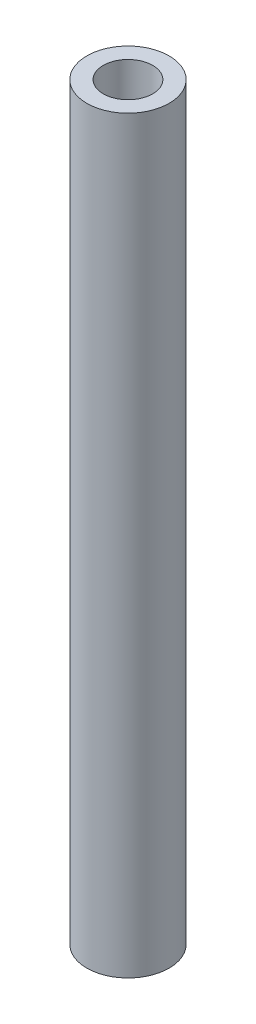
ISO-10303-21;
HEADER;
FILE_DESCRIPTION(('STEP AP214'),'2;1');
FILE_NAME('part.step','',(''),(''),'','','');
FILE_SCHEMA(('AUTOMOTIVE_DESIGN { 1 0 10303 214 1 1 1 1 }'));
ENDSEC;
DATA;
#1=APPLICATION_CONTEXT('core data for automotive mechanical design processes');
#2=APPLICATION_PROTOCOL_DEFINITION('international standard','automotive_design',2000,#1);
#3=PRODUCT_CONTEXT('',#1,'mechanical');
#4=PRODUCT('Part','Part','',(#3));
#5=PRODUCT_RELATED_PRODUCT_CATEGORY('part','',(#4));
#6=PRODUCT_DEFINITION_FORMATION('','',#4);
#7=PRODUCT_DEFINITION_CONTEXT('part definition',#1,'design');
#8=PRODUCT_DEFINITION('design','',#6,#7);
#9=PRODUCT_DEFINITION_SHAPE('','',#8);
#10=(LENGTH_UNIT() NAMED_UNIT(*) SI_UNIT(.MILLI.,.METRE.));
#11=(NAMED_UNIT(*) PLANE_ANGLE_UNIT() SI_UNIT($,.RADIAN.));
#12=(NAMED_UNIT(*) SI_UNIT($,.STERADIAN.) SOLID_ANGLE_UNIT());
#13=UNCERTAINTY_MEASURE_WITH_UNIT(LENGTH_MEASURE(1.E-05),#10,'distance_accuracy_value','');
#14=(GEOMETRIC_REPRESENTATION_CONTEXT(3) GLOBAL_UNCERTAINTY_ASSIGNED_CONTEXT((#13)) GLOBAL_UNIT_ASSIGNED_CONTEXT((#10,
#11,#12)) REPRESENTATION_CONTEXT('',''));
#15=CARTESIAN_POINT('',(0.,0.,0.));
#16=DIRECTION('',(0.,0.,1.));
#17=DIRECTION('',(1.,0.,0.));
#18=AXIS2_PLACEMENT_3D('',#15,#16,#17);
#19=CARTESIAN_POINT('',(0.,45.5,0.));
#20=DIRECTION('',(0.,1.,0.));
#21=DIRECTION('',(0.,0.,1.));
#22=AXIS2_PLACEMENT_3D('',#19,#20,#21);
#23=PLANE('',#22);
#24=CARTESIAN_POINT('',(0.,45.5,0.));
#25=DIRECTION('',(0.,1.,0.));
#26=DIRECTION('',(0.,0.,1.));
#27=AXIS2_PLACEMENT_3D('',#24,#25,#26);
#28=CIRCLE('',#27,2.5);
#29=CARTESIAN_POINT('',(0.,45.5,2.5));
#30=VERTEX_POINT('',#29);
#31=EDGE_CURVE('E10',#30,#30,#28,.T.);
#32=ORIENTED_EDGE('',*,*,#31,.T.);
#33=EDGE_LOOP('',(#32));
#34=FACE_BOUND('',#33,.T.);
#35=CARTESIAN_POINT('',(0.,45.5,0.));
#36=DIRECTION('',(0.,1.,0.));
#37=DIRECTION('',(0.,0.,1.));
#38=AXIS2_PLACEMENT_3D('',#35,#36,#37);
#39=CIRCLE('',#38,1.5);
#40=CARTESIAN_POINT('',(0.,45.5,1.5));
#41=VERTEX_POINT('',#40);
#42=EDGE_CURVE('E44',#41,#41,#39,.T.);
#43=ORIENTED_EDGE('',*,*,#42,.F.);
#44=EDGE_LOOP('',(#43));
#45=FACE_BOUND('',#44,.T.);
#46=ADVANCED_FACE('F33',(#34,#45),#23,.T.);
#47=CARTESIAN_POINT('',(0.,0.,0.));
#48=DIRECTION('',(0.,1.,0.));
#49=DIRECTION('',(0.,0.,1.));
#50=AXIS2_PLACEMENT_3D('',#47,#48,#49);
#51=PLANE('',#50);
#52=CARTESIAN_POINT('',(0.,0.,0.));
#53=DIRECTION('',(0.,1.,0.));
#54=DIRECTION('',(0.,0.,1.));
#55=AXIS2_PLACEMENT_3D('',#52,#53,#54);
#56=CIRCLE('',#55,2.5);
#57=CARTESIAN_POINT('',(0.,0.,2.5));
#58=VERTEX_POINT('',#57);
#59=EDGE_CURVE('E37',#58,#58,#56,.T.);
#60=ORIENTED_EDGE('',*,*,#59,.F.);
#61=EDGE_LOOP('',(#60));
#62=FACE_BOUND('',#61,.T.);
#63=CARTESIAN_POINT('',(0.,0.,0.));
#64=DIRECTION('',(0.,1.,0.));
#65=DIRECTION('',(0.,0.,1.));
#66=AXIS2_PLACEMENT_3D('',#63,#64,#65);
#67=CIRCLE('',#66,1.5);
#68=CARTESIAN_POINT('',(0.,0.,1.5));
#69=VERTEX_POINT('',#68);
#70=EDGE_CURVE('E46',#69,#69,#67,.T.);
#71=ORIENTED_EDGE('',*,*,#70,.T.);
#72=EDGE_LOOP('',(#71));
#73=FACE_BOUND('',#72,.T.);
#74=ADVANCED_FACE('F56',(#62,#73),#51,.F.);
#75=CARTESIAN_POINT('',(0.,45.5,0.));
#76=DIRECTION('',(0.,-1.,0.));
#77=DIRECTION('',(0.,0.,-1.));
#78=AXIS2_PLACEMENT_3D('',#75,#76,#77);
#79=CYLINDRICAL_SURFACE('',#78,2.5);
#80=ORIENTED_EDGE('',*,*,#31,.F.);
#81=EDGE_LOOP('',(#80));
#82=FACE_BOUND('',#81,.T.);
#83=ORIENTED_EDGE('',*,*,#59,.T.);
#84=EDGE_LOOP('',(#83));
#85=FACE_BOUND('',#84,.T.);
#86=ADVANCED_FACE('F35',(#82,#85),#79,.T.);
#87=CARTESIAN_POINT('',(0.,45.5,0.));
#88=DIRECTION('',(0.,-1.,0.));
#89=DIRECTION('',(0.,0.,-1.));
#90=AXIS2_PLACEMENT_3D('',#87,#88,#89);
#91=CYLINDRICAL_SURFACE('',#90,1.5);
#92=ORIENTED_EDGE('',*,*,#42,.T.);
#93=EDGE_LOOP('',(#92));
#94=FACE_BOUND('',#93,.T.);
#95=ORIENTED_EDGE('',*,*,#70,.F.);
#96=EDGE_LOOP('',(#95));
#97=FACE_BOUND('',#96,.T.);
#98=ADVANCED_FACE('F52',(#94,#97),#91,.F.);
#99=CLOSED_SHELL('',(#46,#74,#86,#98));
#100=MANIFOLD_SOLID_BREP('B2',#99);
#101=ADVANCED_BREP_SHAPE_REPRESENTATION('',(#18,#100),#14);
#102=SHAPE_DEFINITION_REPRESENTATION(#9,#101);
ENDSEC;
END-ISO-10303-21;
